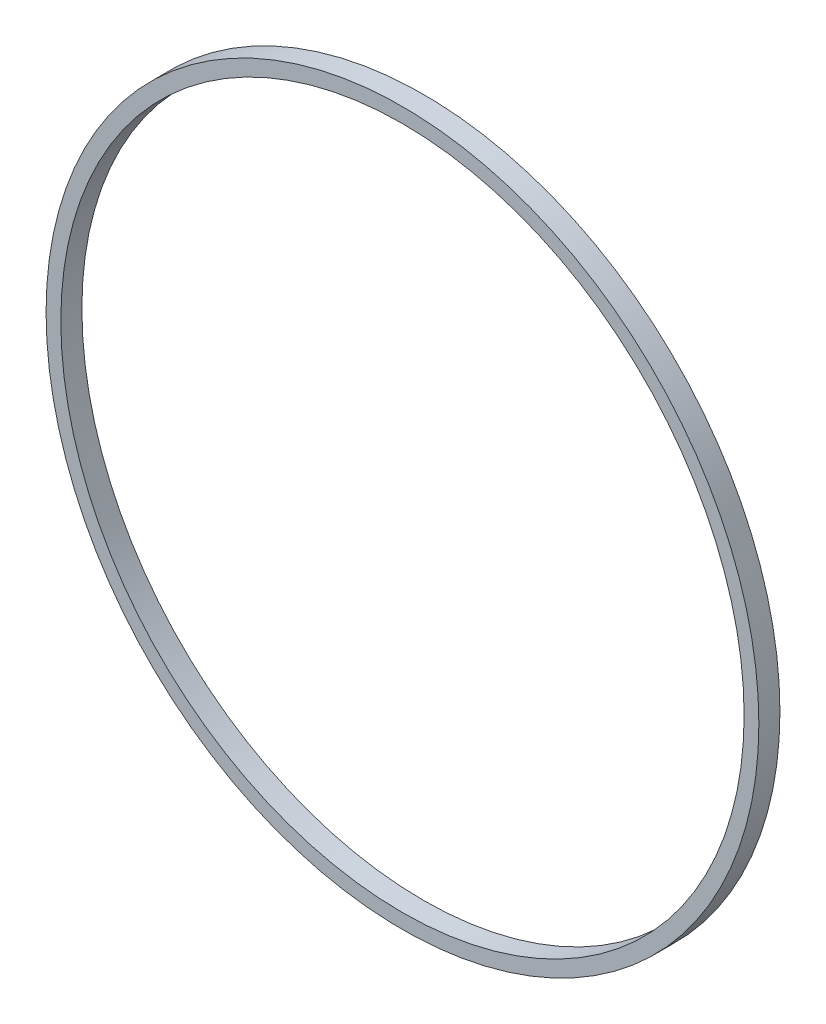
ISO-10303-21;
HEADER;
FILE_DESCRIPTION(('STEP AP214'),'2;1');
FILE_NAME('part.step','',(''),(''),'','','');
FILE_SCHEMA(('AUTOMOTIVE_DESIGN { 1 0 10303 214 1 1 1 1 }'));
ENDSEC;
DATA;
#1=APPLICATION_CONTEXT('core data for automotive mechanical design processes');
#2=APPLICATION_PROTOCOL_DEFINITION('international standard','automotive_design',2000,#1);
#3=PRODUCT_CONTEXT('',#1,'mechanical');
#4=PRODUCT('Part','Part','',(#3));
#5=PRODUCT_RELATED_PRODUCT_CATEGORY('part','',(#4));
#6=PRODUCT_DEFINITION_FORMATION('','',#4);
#7=PRODUCT_DEFINITION_CONTEXT('part definition',#1,'design');
#8=PRODUCT_DEFINITION('design','',#6,#7);
#9=PRODUCT_DEFINITION_SHAPE('','',#8);
#10=(LENGTH_UNIT() NAMED_UNIT(*) SI_UNIT(.MILLI.,.METRE.));
#11=(NAMED_UNIT(*) PLANE_ANGLE_UNIT() SI_UNIT($,.RADIAN.));
#12=(NAMED_UNIT(*) SI_UNIT($,.STERADIAN.) SOLID_ANGLE_UNIT());
#13=UNCERTAINTY_MEASURE_WITH_UNIT(LENGTH_MEASURE(1.E-05),#10,'distance_accuracy_value','');
#14=(GEOMETRIC_REPRESENTATION_CONTEXT(3) GLOBAL_UNCERTAINTY_ASSIGNED_CONTEXT((#13)) GLOBAL_UNIT_ASSIGNED_CONTEXT((#10,
#11,#12)) REPRESENTATION_CONTEXT('',''));
#15=CARTESIAN_POINT('',(0.,0.,0.));
#16=DIRECTION('',(0.,0.,1.));
#17=DIRECTION('',(1.,0.,0.));
#18=AXIS2_PLACEMENT_3D('',#15,#16,#17);
#19=CARTESIAN_POINT('',(0.,0.,5.));
#20=DIRECTION('',(0.,0.,1.));
#21=DIRECTION('',(1.,0.,0.));
#22=AXIS2_PLACEMENT_3D('',#19,#20,#21);
#23=PLANE('',#22);
#24=CARTESIAN_POINT('',(0.,0.,5.));
#25=DIRECTION('',(0.,0.,1.));
#26=DIRECTION('',(1.,0.,0.));
#27=AXIS2_PLACEMENT_3D('',#24,#25,#26);
#28=CIRCLE('',#27,84.6);
#29=CARTESIAN_POINT('',(84.6,0.,5.));
#30=VERTEX_POINT('',#29);
#31=EDGE_CURVE('E10',#30,#30,#28,.T.);
#32=ORIENTED_EDGE('',*,*,#31,.T.);
#33=EDGE_LOOP('',(#32));
#34=FACE_BOUND('',#33,.T.);
#35=CARTESIAN_POINT('',(0.,0.,5.));
#36=DIRECTION('',(0.,0.,1.));
#37=DIRECTION('',(1.,0.,0.));
#38=AXIS2_PLACEMENT_3D('',#35,#36,#37);
#39=CIRCLE('',#38,81.1);
#40=CARTESIAN_POINT('',(81.1,0.,5.));
#41=VERTEX_POINT('',#40);
#42=EDGE_CURVE('E50',#41,#41,#39,.T.);
#43=ORIENTED_EDGE('',*,*,#42,.F.);
#44=EDGE_LOOP('',(#43));
#45=FACE_BOUND('',#44,.T.);
#46=ADVANCED_FACE('F37',(#34,#45),#23,.T.);
#47=CARTESIAN_POINT('',(0.,0.,0.));
#48=DIRECTION('',(0.,0.,1.));
#49=DIRECTION('',(1.,0.,0.));
#50=AXIS2_PLACEMENT_3D('',#47,#48,#49);
#51=PLANE('',#50);
#52=CARTESIAN_POINT('',(0.,0.,0.));
#53=DIRECTION('',(0.,0.,1.));
#54=DIRECTION('',(1.,0.,0.));
#55=AXIS2_PLACEMENT_3D('',#52,#53,#54);
#56=CIRCLE('',#55,84.6);
#57=CARTESIAN_POINT('',(84.6,0.,0.));
#58=VERTEX_POINT('',#57);
#59=EDGE_CURVE('E41',#58,#58,#56,.T.);
#60=ORIENTED_EDGE('',*,*,#59,.F.);
#61=EDGE_LOOP('',(#60));
#62=FACE_BOUND('',#61,.T.);
#63=CARTESIAN_POINT('',(0.,0.,0.));
#64=DIRECTION('',(0.,0.,1.));
#65=DIRECTION('',(1.,0.,0.));
#66=AXIS2_PLACEMENT_3D('',#63,#64,#65);
#67=CIRCLE('',#66,81.1);
#68=CARTESIAN_POINT('',(81.1,0.,0.));
#69=VERTEX_POINT('',#68);
#70=EDGE_CURVE('E52',#69,#69,#67,.T.);
#71=ORIENTED_EDGE('',*,*,#70,.T.);
#72=EDGE_LOOP('',(#71));
#73=FACE_BOUND('',#72,.T.);
#74=ADVANCED_FACE('F64',(#62,#73),#51,.F.);
#75=CARTESIAN_POINT('',(0.,0.,5.));
#76=DIRECTION('',(0.,0.,-1.));
#77=DIRECTION('',(-1.,0.,0.));
#78=AXIS2_PLACEMENT_3D('',#75,#76,#77);
#79=CYLINDRICAL_SURFACE('',#78,84.6);
#80=ORIENTED_EDGE('',*,*,#31,.F.);
#81=EDGE_LOOP('',(#80));
#82=FACE_BOUND('',#81,.T.);
#83=ORIENTED_EDGE('',*,*,#59,.T.);
#84=EDGE_LOOP('',(#83));
#85=FACE_BOUND('',#84,.T.);
#86=ADVANCED_FACE('F39',(#82,#85),#79,.T.);
#87=CARTESIAN_POINT('',(0.,0.,5.));
#88=DIRECTION('',(0.,0.,-1.));
#89=DIRECTION('',(-1.,0.,0.));
#90=AXIS2_PLACEMENT_3D('',#87,#88,#89);
#91=CYLINDRICAL_SURFACE('',#90,81.1);
#92=ORIENTED_EDGE('',*,*,#42,.T.);
#93=EDGE_LOOP('',(#92));
#94=FACE_BOUND('',#93,.T.);
#95=ORIENTED_EDGE('',*,*,#70,.F.);
#96=EDGE_LOOP('',(#95));
#97=FACE_BOUND('',#96,.T.);
#98=ADVANCED_FACE('F60',(#94,#97),#91,.F.);
#99=CLOSED_SHELL('',(#46,#74,#86,#98));
#100=MANIFOLD_SOLID_BREP('B2',#99);
#101=ADVANCED_BREP_SHAPE_REPRESENTATION('',(#18,#100),#14);
#102=SHAPE_DEFINITION_REPRESENTATION(#9,#101);
ENDSEC;
END-ISO-10303-21;
